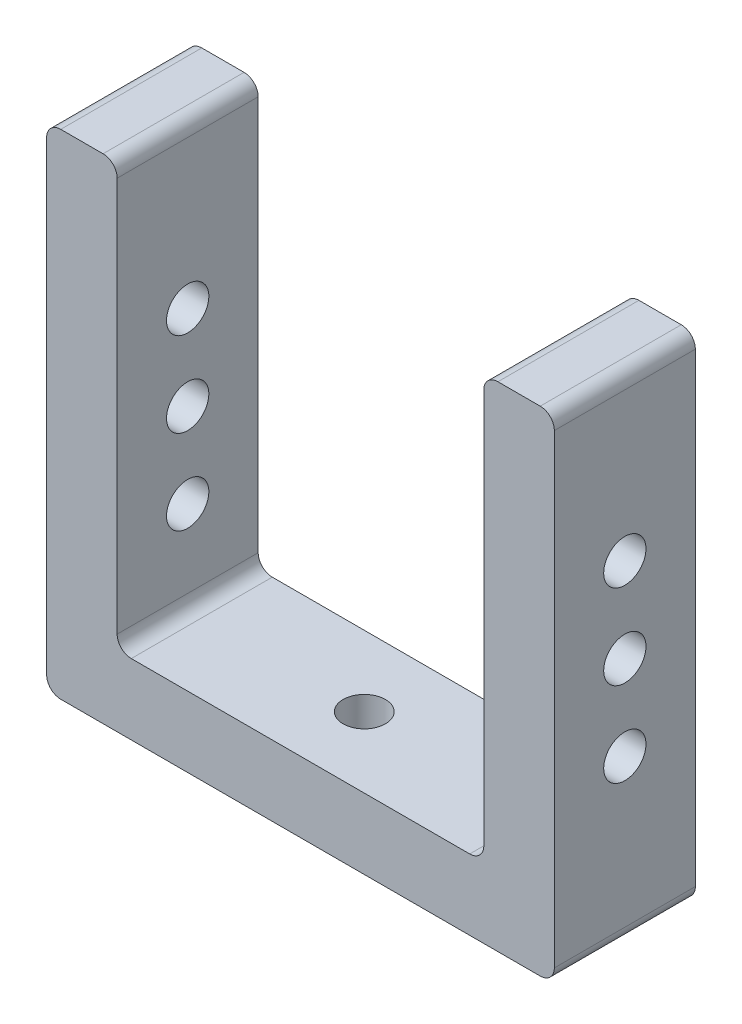
ISO-10303-21;
HEADER;
FILE_DESCRIPTION(('STEP AP214'),'2;1');
FILE_NAME('part.step','',(''),(''),'','','');
FILE_SCHEMA(('AUTOMOTIVE_DESIGN { 1 0 10303 214 1 1 1 1 }'));
ENDSEC;
DATA;
#1=APPLICATION_CONTEXT('core data for automotive mechanical design processes');
#2=APPLICATION_PROTOCOL_DEFINITION('international standard','automotive_design',2000,#1);
#3=PRODUCT_CONTEXT('',#1,'mechanical');
#4=PRODUCT('Part','Part','',(#3));
#5=PRODUCT_RELATED_PRODUCT_CATEGORY('part','',(#4));
#6=PRODUCT_DEFINITION_FORMATION('','',#4);
#7=PRODUCT_DEFINITION_CONTEXT('part definition',#1,'design');
#8=PRODUCT_DEFINITION('design','',#6,#7);
#9=PRODUCT_DEFINITION_SHAPE('','',#8);
#10=(LENGTH_UNIT() NAMED_UNIT(*) SI_UNIT(.MILLI.,.METRE.));
#11=(NAMED_UNIT(*) PLANE_ANGLE_UNIT() SI_UNIT($,.RADIAN.));
#12=(NAMED_UNIT(*) SI_UNIT($,.STERADIAN.) SOLID_ANGLE_UNIT());
#13=UNCERTAINTY_MEASURE_WITH_UNIT(LENGTH_MEASURE(1.E-05),#10,'distance_accuracy_value','');
#14=(GEOMETRIC_REPRESENTATION_CONTEXT(3) GLOBAL_UNCERTAINTY_ASSIGNED_CONTEXT((#13)) GLOBAL_UNIT_ASSIGNED_CONTEXT((#10,
#11,#12)) REPRESENTATION_CONTEXT('',''));
#15=CARTESIAN_POINT('',(0.,0.,0.));
#16=DIRECTION('',(0.,0.,1.));
#17=DIRECTION('',(1.,0.,0.));
#18=AXIS2_PLACEMENT_3D('',#15,#16,#17);
#19=CARTESIAN_POINT('',(-16.0463208437643,-4.00000000000001,10.));
#20=DIRECTION('',(0.,0.,-1.));
#21=DIRECTION('',(-1.,0.,0.));
#22=AXIS2_PLACEMENT_3D('',#19,#20,#21);
#23=CYLINDRICAL_SURFACE('',#22,1.);
#24=CARTESIAN_POINT('',(-16.0463208437643,-4.00000000000001,0.));
#25=DIRECTION('',(0.,0.,-1.));
#26=DIRECTION('',(-1.,0.,0.));
#27=AXIS2_PLACEMENT_3D('',#24,#25,#26);
#28=CIRCLE('',#27,1.);
#29=CARTESIAN_POINT('',(-16.0463208437643,-5.00000000000001,0.));
#30=VERTEX_POINT('',#29);
#31=CARTESIAN_POINT('',(-17.0463208437643,-4.00000000000001,0.));
#32=VERTEX_POINT('',#31);
#33=EDGE_CURVE('E210',#30,#32,#28,.T.);
#34=ORIENTED_EDGE('',*,*,#33,.F.);
#35=DIRECTION('',(0.,0.,-1.));
#36=VECTOR('',#35,1.);
#37=CARTESIAN_POINT('',(-16.0463208437643,-5.00000000000001,10.));
#38=LINE('',#37,#36);
#39=CARTESIAN_POINT('',(-16.0463208437643,-5.00000000000001,10.));
#40=VERTEX_POINT('',#39);
#41=EDGE_CURVE('E176',#40,#30,#38,.T.);
#42=ORIENTED_EDGE('',*,*,#41,.F.);
#43=CARTESIAN_POINT('',(-16.0463208437643,-4.00000000000001,10.));
#44=DIRECTION('',(0.,0.,-1.));
#45=DIRECTION('',(-1.,0.,0.));
#46=AXIS2_PLACEMENT_3D('',#43,#44,#45);
#47=CIRCLE('',#46,1.);
#48=CARTESIAN_POINT('',(-17.0463208437643,-4.00000000000001,10.));
#49=VERTEX_POINT('',#48);
#50=EDGE_CURVE('E172',#40,#49,#47,.T.);
#51=ORIENTED_EDGE('',*,*,#50,.T.);
#52=DIRECTION('',(0.,0.,-1.));
#53=VECTOR('',#52,1.);
#54=CARTESIAN_POINT('',(-17.0463208437643,-4.00000000000001,10.));
#55=LINE('',#54,#53);
#56=EDGE_CURVE('E154',#49,#32,#55,.T.);
#57=ORIENTED_EDGE('',*,*,#56,.T.);
#58=EDGE_LOOP('',(#34,#42,#51,#57));
#59=FACE_BOUND('',#58,.T.);
#60=ADVANCED_FACE('F40',(#59),#23,.T.);
#61=CARTESIAN_POINT('',(17.9536791562357,-5.,10.));
#62=DIRECTION('',(0.,-1.,0.));
#63=DIRECTION('',(1.,0.,0.));
#64=AXIS2_PLACEMENT_3D('',#61,#62,#63);
#65=PLANE('',#64);
#66=CARTESIAN_POINT('',(0.476839578117848,-5.,5.));
#67=DIRECTION('',(0.,-1.,0.));
#68=DIRECTION('',(1.,0.,0.));
#69=AXIS2_PLACEMENT_3D('',#66,#67,#68);
#70=CIRCLE('',#69,1.5);
#71=CARTESIAN_POINT('',(1.97683957811785,-5.,5.));
#72=VERTEX_POINT('',#71);
#73=EDGE_CURVE('E183',#72,#72,#70,.T.);
#74=ORIENTED_EDGE('',*,*,#73,.F.);
#75=EDGE_LOOP('',(#74));
#76=FACE_BOUND('',#75,.T.);
#77=DIRECTION('',(-1.,0.,0.));
#78=VECTOR('',#77,1.);
#79=CARTESIAN_POINT('',(17.9536791562357,-5.,0.));
#80=LINE('',#79,#78);
#81=CARTESIAN_POINT('',(17.9536791562357,-5.,0.));
#82=VERTEX_POINT('',#81);
#83=EDGE_CURVE('E177',#82,#30,#80,.T.);
#84=ORIENTED_EDGE('',*,*,#83,.F.);
#85=DIRECTION('',(0.,0.,-1.));
#86=VECTOR('',#85,1.);
#87=CARTESIAN_POINT('',(17.9536791562357,-5.,10.));
#88=LINE('',#87,#86);
#89=CARTESIAN_POINT('',(17.9536791562357,-5.,10.));
#90=VERTEX_POINT('',#89);
#91=EDGE_CURVE('E239',#90,#82,#88,.T.);
#92=ORIENTED_EDGE('',*,*,#91,.F.);
#93=DIRECTION('',(-1.,0.,0.));
#94=VECTOR('',#93,1.);
#95=CARTESIAN_POINT('',(17.9536791562357,-5.,10.));
#96=LINE('',#95,#94);
#97=EDGE_CURVE('E166',#90,#40,#96,.T.);
#98=ORIENTED_EDGE('',*,*,#97,.T.);
#99=ORIENTED_EDGE('',*,*,#41,.T.);
#100=EDGE_LOOP('',(#84,#92,#98,#99));
#101=FACE_BOUND('',#100,.T.);
#102=ADVANCED_FACE('F292',(#76,#101),#65,.T.);
#103=CARTESIAN_POINT('',(17.9536791562357,-4.,10.));
#104=DIRECTION('',(0.,0.,-1.));
#105=DIRECTION('',(-1.,0.,0.));
#106=AXIS2_PLACEMENT_3D('',#103,#104,#105);
#107=CYLINDRICAL_SURFACE('',#106,1.);
#108=CARTESIAN_POINT('',(17.9536791562357,-4.,0.));
#109=DIRECTION('',(0.,0.,-1.));
#110=DIRECTION('',(-1.,0.,0.));
#111=AXIS2_PLACEMENT_3D('',#108,#109,#110);
#112=CIRCLE('',#111,1.);
#113=CARTESIAN_POINT('',(18.9536791562357,-4.,0.));
#114=VERTEX_POINT('',#113);
#115=EDGE_CURVE('E180',#114,#82,#112,.T.);
#116=ORIENTED_EDGE('',*,*,#115,.F.);
#117=DIRECTION('',(0.,0.,-1.));
#118=VECTOR('',#117,1.);
#119=CARTESIAN_POINT('',(18.9536791562357,-4.,10.));
#120=LINE('',#119,#118);
#121=CARTESIAN_POINT('',(18.9536791562357,-4.,10.));
#122=VERTEX_POINT('',#121);
#123=EDGE_CURVE('E241',#122,#114,#120,.T.);
#124=ORIENTED_EDGE('',*,*,#123,.F.);
#125=CARTESIAN_POINT('',(17.9536791562357,-4.,10.));
#126=DIRECTION('',(0.,0.,-1.));
#127=DIRECTION('',(-1.,0.,0.));
#128=AXIS2_PLACEMENT_3D('',#125,#126,#127);
#129=CIRCLE('',#128,1.);
#130=EDGE_CURVE('E206',#122,#90,#129,.T.);
#131=ORIENTED_EDGE('',*,*,#130,.T.);
#132=ORIENTED_EDGE('',*,*,#91,.T.);
#133=EDGE_LOOP('',(#116,#124,#131,#132));
#134=FACE_BOUND('',#133,.T.);
#135=ADVANCED_FACE('F297',(#134),#107,.T.);
#136=CARTESIAN_POINT('',(18.9536791562357,30.,10.));
#137=DIRECTION('',(1.,0.,0.));
#138=DIRECTION('',(0.,1.,0.));
#139=AXIS2_PLACEMENT_3D('',#136,#137,#138);
#140=PLANE('',#139);
#141=CARTESIAN_POINT('',(18.9536791562357,18.5,5.));
#142=DIRECTION('',(-1.,0.,0.));
#143=DIRECTION('',(0.,0.,1.));
#144=AXIS2_PLACEMENT_3D('',#141,#142,#143);
#145=CIRCLE('',#144,1.5);
#146=CARTESIAN_POINT('',(18.9536791562357,18.5,6.5));
#147=VERTEX_POINT('',#146);
#148=EDGE_CURVE('E432',#147,#147,#145,.T.);
#149=ORIENTED_EDGE('',*,*,#148,.T.);
#150=EDGE_LOOP('',(#149));
#151=FACE_BOUND('',#150,.T.);
#152=CARTESIAN_POINT('',(18.9536791562357,6.5,5.));
#153=DIRECTION('',(-1.,0.,0.));
#154=DIRECTION('',(0.,0.,1.));
#155=AXIS2_PLACEMENT_3D('',#152,#153,#154);
#156=CIRCLE('',#155,1.5);
#157=CARTESIAN_POINT('',(18.9536791562357,6.5,6.5));
#158=VERTEX_POINT('',#157);
#159=EDGE_CURVE('E438',#158,#158,#156,.T.);
#160=ORIENTED_EDGE('',*,*,#159,.T.);
#161=EDGE_LOOP('',(#160));
#162=FACE_BOUND('',#161,.T.);
#163=CARTESIAN_POINT('',(18.9536791562357,12.5,5.));
#164=DIRECTION('',(-1.,0.,0.));
#165=DIRECTION('',(0.,0.,1.));
#166=AXIS2_PLACEMENT_3D('',#163,#164,#165);
#167=CIRCLE('',#166,1.5);
#168=CARTESIAN_POINT('',(18.9536791562357,12.5,6.5));
#169=VERTEX_POINT('',#168);
#170=EDGE_CURVE('E425',#169,#169,#167,.T.);
#171=ORIENTED_EDGE('',*,*,#170,.T.);
#172=EDGE_LOOP('',(#171));
#173=FACE_BOUND('',#172,.T.);
#174=DIRECTION('',(0.,-1.,0.));
#175=VECTOR('',#174,1.);
#176=CARTESIAN_POINT('',(18.9536791562357,30.,0.));
#177=LINE('',#176,#175);
#178=CARTESIAN_POINT('',(18.9536791562357,29.,0.));
#179=VERTEX_POINT('',#178);
#180=EDGE_CURVE('E233',#179,#114,#177,.T.);
#181=ORIENTED_EDGE('',*,*,#180,.F.);
#182=DIRECTION('',(0.,0.,-1.));
#183=VECTOR('',#182,1.);
#184=CARTESIAN_POINT('',(18.9536791562357,29.,10.));
#185=LINE('',#184,#183);
#186=CARTESIAN_POINT('',(18.9536791562357,29.,10.));
#187=VERTEX_POINT('',#186);
#188=EDGE_CURVE('E264',#179,#187,#185,.F.);
#189=ORIENTED_EDGE('',*,*,#188,.T.);
#190=DIRECTION('',(0.,-1.,0.));
#191=VECTOR('',#190,1.);
#192=CARTESIAN_POINT('',(18.9536791562357,30.,10.));
#193=LINE('',#192,#191);
#194=EDGE_CURVE('E204',#187,#122,#193,.T.);
#195=ORIENTED_EDGE('',*,*,#194,.T.);
#196=ORIENTED_EDGE('',*,*,#123,.T.);
#197=EDGE_LOOP('',(#181,#189,#195,#196));
#198=FACE_BOUND('',#197,.T.);
#199=ADVANCED_FACE('F300',(#151,#162,#173,#198),#140,.T.);
#200=CARTESIAN_POINT('',(13.9536791562357,30.,10.));
#201=DIRECTION('',(0.,1.,0.));
#202=DIRECTION('',(0.,0.,1.));
#203=AXIS2_PLACEMENT_3D('',#200,#201,#202);
#204=PLANE('',#203);
#205=DIRECTION('',(1.,0.,0.));
#206=VECTOR('',#205,1.);
#207=CARTESIAN_POINT('',(13.9536791562357,30.,10.));
#208=LINE('',#207,#206);
#209=CARTESIAN_POINT('',(14.9536791562357,30.,10.));
#210=VERTEX_POINT('',#209);
#211=CARTESIAN_POINT('',(17.9536791562357,30.,10.));
#212=VERTEX_POINT('',#211);
#213=EDGE_CURVE('E201',#210,#212,#208,.T.);
#214=ORIENTED_EDGE('',*,*,#213,.T.);
#215=DIRECTION('',(0.,0.,-1.));
#216=VECTOR('',#215,1.);
#217=CARTESIAN_POINT('',(17.9536791562357,30.,10.));
#218=LINE('',#217,#216);
#219=CARTESIAN_POINT('',(17.9536791562357,30.,0.));
#220=VERTEX_POINT('',#219);
#221=EDGE_CURVE('E253',#212,#220,#218,.T.);
#222=ORIENTED_EDGE('',*,*,#221,.T.);
#223=DIRECTION('',(1.,0.,0.));
#224=VECTOR('',#223,1.);
#225=CARTESIAN_POINT('',(13.9536791562357,30.,0.));
#226=LINE('',#225,#224);
#227=CARTESIAN_POINT('',(14.9536791562357,30.,0.));
#228=VERTEX_POINT('',#227);
#229=EDGE_CURVE('E230',#228,#220,#226,.T.);
#230=ORIENTED_EDGE('',*,*,#229,.F.);
#231=DIRECTION('',(0.,0.,-1.));
#232=VECTOR('',#231,1.);
#233=CARTESIAN_POINT('',(14.9536791562357,30.,10.));
#234=LINE('',#233,#232);
#235=EDGE_CURVE('E238',#228,#210,#234,.F.);
#236=ORIENTED_EDGE('',*,*,#235,.T.);
#237=EDGE_LOOP('',(#214,#222,#230,#236));
#238=FACE_BOUND('',#237,.T.);
#239=ADVANCED_FACE('F308',(#238),#204,.T.);
#240=CARTESIAN_POINT('',(13.9536791562357,1.,10.));
#241=DIRECTION('',(-1.,0.,0.));
#242=DIRECTION('',(0.,0.,1.));
#243=AXIS2_PLACEMENT_3D('',#240,#241,#242);
#244=PLANE('',#243);
#245=CARTESIAN_POINT('',(13.9536791562357,18.5,5.));
#246=DIRECTION('',(-1.,0.,0.));
#247=DIRECTION('',(0.,0.,1.));
#248=AXIS2_PLACEMENT_3D('',#245,#246,#247);
#249=CIRCLE('',#248,1.5);
#250=CARTESIAN_POINT('',(13.9536791562357,18.5,6.5));
#251=VERTEX_POINT('',#250);
#252=EDGE_CURVE('E404',#251,#251,#249,.T.);
#253=ORIENTED_EDGE('',*,*,#252,.F.);
#254=EDGE_LOOP('',(#253));
#255=FACE_BOUND('',#254,.T.);
#256=CARTESIAN_POINT('',(13.9536791562357,6.5,5.));
#257=DIRECTION('',(-1.,0.,0.));
#258=DIRECTION('',(0.,0.,1.));
#259=AXIS2_PLACEMENT_3D('',#256,#257,#258);
#260=CIRCLE('',#259,1.5);
#261=CARTESIAN_POINT('',(13.9536791562357,6.5,6.5));
#262=VERTEX_POINT('',#261);
#263=EDGE_CURVE('E411',#262,#262,#260,.T.);
#264=ORIENTED_EDGE('',*,*,#263,.F.);
#265=EDGE_LOOP('',(#264));
#266=FACE_BOUND('',#265,.T.);
#267=CARTESIAN_POINT('',(13.9536791562357,12.5,5.));
#268=DIRECTION('',(-1.,0.,0.));
#269=DIRECTION('',(0.,0.,1.));
#270=AXIS2_PLACEMENT_3D('',#267,#268,#269);
#271=CIRCLE('',#270,1.5);
#272=CARTESIAN_POINT('',(13.9536791562357,12.5,6.5));
#273=VERTEX_POINT('',#272);
#274=EDGE_CURVE('E419',#273,#273,#271,.T.);
#275=ORIENTED_EDGE('',*,*,#274,.F.);
#276=EDGE_LOOP('',(#275));
#277=FACE_BOUND('',#276,.T.);
#278=DIRECTION('',(0.,1.,0.));
#279=VECTOR('',#278,1.);
#280=CARTESIAN_POINT('',(13.9536791562357,1.,10.));
#281=LINE('',#280,#279);
#282=CARTESIAN_POINT('',(13.9536791562357,1.,10.));
#283=VERTEX_POINT('',#282);
#284=CARTESIAN_POINT('',(13.9536791562357,29.,10.));
#285=VERTEX_POINT('',#284);
#286=EDGE_CURVE('E198',#283,#285,#281,.T.);
#287=ORIENTED_EDGE('',*,*,#286,.T.);
#288=DIRECTION('',(0.,0.,-1.));
#289=VECTOR('',#288,1.);
#290=CARTESIAN_POINT('',(13.9536791562357,29.,10.));
#291=LINE('',#290,#289);
#292=CARTESIAN_POINT('',(13.9536791562357,29.,0.));
#293=VERTEX_POINT('',#292);
#294=EDGE_CURVE('E272',#285,#293,#291,.T.);
#295=ORIENTED_EDGE('',*,*,#294,.T.);
#296=DIRECTION('',(0.,1.,0.));
#297=VECTOR('',#296,1.);
#298=CARTESIAN_POINT('',(13.9536791562357,1.,0.));
#299=LINE('',#298,#297);
#300=CARTESIAN_POINT('',(13.9536791562357,1.,0.));
#301=VERTEX_POINT('',#300);
#302=EDGE_CURVE('E227',#301,#293,#299,.T.);
#303=ORIENTED_EDGE('',*,*,#302,.F.);
#304=DIRECTION('',(0.,0.,-1.));
#305=VECTOR('',#304,1.);
#306=CARTESIAN_POINT('',(13.9536791562357,1.,10.));
#307=LINE('',#306,#305);
#308=EDGE_CURVE('E244',#283,#301,#307,.T.);
#309=ORIENTED_EDGE('',*,*,#308,.F.);
#310=EDGE_LOOP('',(#287,#295,#303,#309));
#311=FACE_BOUND('',#310,.T.);
#312=ADVANCED_FACE('F317',(#255,#266,#277,#311),#244,.T.);
#313=CARTESIAN_POINT('',(12.9536791562357,1.,10.));
#314=DIRECTION('',(0.,0.,-1.));
#315=DIRECTION('',(-1.,0.,0.));
#316=AXIS2_PLACEMENT_3D('',#313,#314,#315);
#317=CYLINDRICAL_SURFACE('',#316,1.);
#318=CARTESIAN_POINT('',(12.9536791562357,1.,0.));
#319=DIRECTION('',(0.,0.,1.));
#320=DIRECTION('',(1.,0.,0.));
#321=AXIS2_PLACEMENT_3D('',#318,#319,#320);
#322=CIRCLE('',#321,1.);
#323=CARTESIAN_POINT('',(12.9536791562357,0.,0.));
#324=VERTEX_POINT('',#323);
#325=EDGE_CURVE('E224',#324,#301,#322,.T.);
#326=ORIENTED_EDGE('',*,*,#325,.F.);
#327=DIRECTION('',(0.,0.,-1.));
#328=VECTOR('',#327,1.);
#329=CARTESIAN_POINT('',(12.9536791562357,0.,10.));
#330=LINE('',#329,#328);
#331=CARTESIAN_POINT('',(12.9536791562357,0.,10.));
#332=VERTEX_POINT('',#331);
#333=EDGE_CURVE('E246',#332,#324,#330,.T.);
#334=ORIENTED_EDGE('',*,*,#333,.F.);
#335=CARTESIAN_POINT('',(12.9536791562357,1.,10.));
#336=DIRECTION('',(0.,0.,1.));
#337=DIRECTION('',(1.,0.,0.));
#338=AXIS2_PLACEMENT_3D('',#335,#336,#337);
#339=CIRCLE('',#338,1.);
#340=EDGE_CURVE('E195',#332,#283,#339,.T.);
#341=ORIENTED_EDGE('',*,*,#340,.T.);
#342=ORIENTED_EDGE('',*,*,#308,.T.);
#343=EDGE_LOOP('',(#326,#334,#341,#342));
#344=FACE_BOUND('',#343,.T.);
#345=ADVANCED_FACE('F321',(#344),#317,.F.);
#346=CARTESIAN_POINT('',(-11.0463208437643,0.,10.));
#347=DIRECTION('',(0.,1.,0.));
#348=DIRECTION('',(0.,0.,1.));
#349=AXIS2_PLACEMENT_3D('',#346,#347,#348);
#350=PLANE('',#349);
#351=CARTESIAN_POINT('',(0.476839578117847,0.,5.));
#352=DIRECTION('',(0.,1.,0.));
#353=DIRECTION('',(0.,0.,1.));
#354=AXIS2_PLACEMENT_3D('',#351,#352,#353);
#355=CIRCLE('',#354,1.5);
#356=CARTESIAN_POINT('',(0.476839578117847,0.,6.5));
#357=VERTEX_POINT('',#356);
#358=EDGE_CURVE('E44',#357,#357,#355,.T.);
#359=ORIENTED_EDGE('',*,*,#358,.F.);
#360=EDGE_LOOP('',(#359));
#361=FACE_BOUND('',#360,.T.);
#362=DIRECTION('',(1.,0.,0.));
#363=VECTOR('',#362,1.);
#364=CARTESIAN_POINT('',(-11.0463208437643,0.,0.));
#365=LINE('',#364,#363);
#366=CARTESIAN_POINT('',(-11.0463208437643,0.,0.));
#367=VERTEX_POINT('',#366);
#368=EDGE_CURVE('E221',#367,#324,#365,.T.);
#369=ORIENTED_EDGE('',*,*,#368,.F.);
#370=DIRECTION('',(0.,0.,-1.));
#371=VECTOR('',#370,1.);
#372=CARTESIAN_POINT('',(-11.0463208437643,0.,10.));
#373=LINE('',#372,#371);
#374=CARTESIAN_POINT('',(-11.0463208437643,0.,10.));
#375=VERTEX_POINT('',#374);
#376=EDGE_CURVE('E248',#375,#367,#373,.T.);
#377=ORIENTED_EDGE('',*,*,#376,.F.);
#378=DIRECTION('',(1.,0.,0.));
#379=VECTOR('',#378,1.);
#380=CARTESIAN_POINT('',(-11.0463208437643,0.,10.));
#381=LINE('',#380,#379);
#382=EDGE_CURVE('E192',#375,#332,#381,.T.);
#383=ORIENTED_EDGE('',*,*,#382,.T.);
#384=ORIENTED_EDGE('',*,*,#333,.T.);
#385=EDGE_LOOP('',(#369,#377,#383,#384));
#386=FACE_BOUND('',#385,.T.);
#387=ADVANCED_FACE('F326',(#361,#386),#350,.T.);
#388=CARTESIAN_POINT('',(-11.0463208437643,1.,10.));
#389=DIRECTION('',(0.,0.,-1.));
#390=DIRECTION('',(-1.,0.,0.));
#391=AXIS2_PLACEMENT_3D('',#388,#389,#390);
#392=CYLINDRICAL_SURFACE('',#391,1.);
#393=CARTESIAN_POINT('',(-11.0463208437643,1.,0.));
#394=DIRECTION('',(0.,0.,1.));
#395=DIRECTION('',(1.,0.,0.));
#396=AXIS2_PLACEMENT_3D('',#393,#394,#395);
#397=CIRCLE('',#396,1.);
#398=CARTESIAN_POINT('',(-12.0463208437643,1.00000000000001,0.));
#399=VERTEX_POINT('',#398);
#400=EDGE_CURVE('E218',#399,#367,#397,.T.);
#401=ORIENTED_EDGE('',*,*,#400,.F.);
#402=DIRECTION('',(0.,0.,-1.));
#403=VECTOR('',#402,1.);
#404=CARTESIAN_POINT('',(-12.0463208437643,1.00000000000001,10.));
#405=LINE('',#404,#403);
#406=CARTESIAN_POINT('',(-12.0463208437643,1.00000000000001,10.));
#407=VERTEX_POINT('',#406);
#408=EDGE_CURVE('E165',#407,#399,#405,.T.);
#409=ORIENTED_EDGE('',*,*,#408,.F.);
#410=CARTESIAN_POINT('',(-11.0463208437643,1.,10.));
#411=DIRECTION('',(0.,0.,1.));
#412=DIRECTION('',(1.,0.,0.));
#413=AXIS2_PLACEMENT_3D('',#410,#411,#412);
#414=CIRCLE('',#413,1.);
#415=EDGE_CURVE('E189',#407,#375,#414,.T.);
#416=ORIENTED_EDGE('',*,*,#415,.T.);
#417=ORIENTED_EDGE('',*,*,#376,.T.);
#418=EDGE_LOOP('',(#401,#409,#416,#417));
#419=FACE_BOUND('',#418,.T.);
#420=ADVANCED_FACE('F329',(#419),#392,.F.);
#421=CARTESIAN_POINT('',(-12.0463208437643,30.,10.));
#422=DIRECTION('',(1.,0.,0.));
#423=DIRECTION('',(0.,1.,0.));
#424=AXIS2_PLACEMENT_3D('',#421,#422,#423);
#425=PLANE('',#424);
#426=CARTESIAN_POINT('',(-12.0463208437643,18.5,5.));
#427=DIRECTION('',(1.,0.,0.));
#428=DIRECTION('',(0.,1.,0.));
#429=AXIS2_PLACEMENT_3D('',#426,#427,#428);
#430=CIRCLE('',#429,1.5);
#431=CARTESIAN_POINT('',(-12.0463208437643,20.,5.));
#432=VERTEX_POINT('',#431);
#433=EDGE_CURVE('E407',#432,#432,#430,.T.);
#434=ORIENTED_EDGE('',*,*,#433,.F.);
#435=EDGE_LOOP('',(#434));
#436=FACE_BOUND('',#435,.T.);
#437=CARTESIAN_POINT('',(-12.0463208437643,6.5,5.));
#438=DIRECTION('',(1.,0.,0.));
#439=DIRECTION('',(0.,1.,0.));
#440=AXIS2_PLACEMENT_3D('',#437,#438,#439);
#441=CIRCLE('',#440,1.5);
#442=CARTESIAN_POINT('',(-12.0463208437643,8.,5.));
#443=VERTEX_POINT('',#442);
#444=EDGE_CURVE('E416',#443,#443,#441,.T.);
#445=ORIENTED_EDGE('',*,*,#444,.F.);
#446=EDGE_LOOP('',(#445));
#447=FACE_BOUND('',#446,.T.);
#448=CARTESIAN_POINT('',(-12.0463208437643,12.5,5.));
#449=DIRECTION('',(1.,0.,0.));
#450=DIRECTION('',(0.,1.,0.));
#451=AXIS2_PLACEMENT_3D('',#448,#449,#450);
#452=CIRCLE('',#451,1.5);
#453=CARTESIAN_POINT('',(-12.0463208437643,14.,5.));
#454=VERTEX_POINT('',#453);
#455=EDGE_CURVE('E422',#454,#454,#452,.T.);
#456=ORIENTED_EDGE('',*,*,#455,.F.);
#457=EDGE_LOOP('',(#456));
#458=FACE_BOUND('',#457,.T.);
#459=DIRECTION('',(0.,-1.,0.));
#460=VECTOR('',#459,1.);
#461=CARTESIAN_POINT('',(-12.0463208437643,30.,0.));
#462=LINE('',#461,#460);
#463=CARTESIAN_POINT('',(-12.0463208437643,29.,0.));
#464=VERTEX_POINT('',#463);
#465=EDGE_CURVE('E216',#464,#399,#462,.T.);
#466=ORIENTED_EDGE('',*,*,#465,.F.);
#467=DIRECTION('',(0.,0.,-1.));
#468=VECTOR('',#467,1.);
#469=CARTESIAN_POINT('',(-12.0463208437643,29.,10.));
#470=LINE('',#469,#468);
#471=CARTESIAN_POINT('',(-12.0463208437643,29.,10.));
#472=VERTEX_POINT('',#471);
#473=EDGE_CURVE('E11',#464,#472,#470,.F.);
#474=ORIENTED_EDGE('',*,*,#473,.T.);
#475=DIRECTION('',(0.,-1.,0.));
#476=VECTOR('',#475,1.);
#477=CARTESIAN_POINT('',(-12.0463208437643,30.,10.));
#478=LINE('',#477,#476);
#479=EDGE_CURVE('E187',#472,#407,#478,.T.);
#480=ORIENTED_EDGE('',*,*,#479,.T.);
#481=ORIENTED_EDGE('',*,*,#408,.T.);
#482=EDGE_LOOP('',(#466,#474,#480,#481));
#483=FACE_BOUND('',#482,.T.);
#484=ADVANCED_FACE('F335',(#436,#447,#458,#483),#425,.T.);
#485=CARTESIAN_POINT('',(-17.0463208437643,30.,10.));
#486=DIRECTION('',(0.,1.,0.));
#487=DIRECTION('',(0.,0.,1.));
#488=AXIS2_PLACEMENT_3D('',#485,#486,#487);
#489=PLANE('',#488);
#490=DIRECTION('',(1.,0.,0.));
#491=VECTOR('',#490,1.);
#492=CARTESIAN_POINT('',(-17.0463208437643,30.,0.));
#493=LINE('',#492,#491);
#494=CARTESIAN_POINT('',(-16.0463208437643,30.,0.));
#495=VERTEX_POINT('',#494);
#496=CARTESIAN_POINT('',(-13.0463208437643,30.,0.));
#497=VERTEX_POINT('',#496);
#498=EDGE_CURVE('E213',#495,#497,#493,.T.);
#499=ORIENTED_EDGE('',*,*,#498,.F.);
#500=DIRECTION('',(0.,0.,-1.));
#501=VECTOR('',#500,1.);
#502=CARTESIAN_POINT('',(-16.0463208437643,30.,10.));
#503=LINE('',#502,#501);
#504=CARTESIAN_POINT('',(-16.0463208437643,30.,10.));
#505=VERTEX_POINT('',#504);
#506=EDGE_CURVE('E49',#495,#505,#503,.F.);
#507=ORIENTED_EDGE('',*,*,#506,.T.);
#508=DIRECTION('',(1.,0.,0.));
#509=VECTOR('',#508,1.);
#510=CARTESIAN_POINT('',(-17.0463208437643,30.,10.));
#511=LINE('',#510,#509);
#512=CARTESIAN_POINT('',(-13.0463208437643,30.,10.));
#513=VERTEX_POINT('',#512);
#514=EDGE_CURVE('E174',#505,#513,#511,.T.);
#515=ORIENTED_EDGE('',*,*,#514,.T.);
#516=DIRECTION('',(0.,0.,-1.));
#517=VECTOR('',#516,1.);
#518=CARTESIAN_POINT('',(-13.0463208437643,30.,10.));
#519=LINE('',#518,#517);
#520=EDGE_CURVE('E277',#513,#497,#519,.T.);
#521=ORIENTED_EDGE('',*,*,#520,.T.);
#522=EDGE_LOOP('',(#499,#507,#515,#521));
#523=FACE_BOUND('',#522,.T.);
#524=ADVANCED_FACE('F283',(#523),#489,.T.);
#525=CARTESIAN_POINT('',(-17.0463208437643,-4.00000000000001,10.));
#526=DIRECTION('',(-1.,0.,0.));
#527=DIRECTION('',(0.,0.,1.));
#528=AXIS2_PLACEMENT_3D('',#525,#526,#527);
#529=PLANE('',#528);
#530=CARTESIAN_POINT('',(-17.0463208437643,18.5,5.));
#531=DIRECTION('',(-1.,0.,0.));
#532=DIRECTION('',(0.,0.,1.));
#533=AXIS2_PLACEMENT_3D('',#530,#531,#532);
#534=CIRCLE('',#533,1.5);
#535=CARTESIAN_POINT('',(-17.0463208437643,18.5,6.5));
#536=VERTEX_POINT('',#535);
#537=EDGE_CURVE('E435',#536,#536,#534,.T.);
#538=ORIENTED_EDGE('',*,*,#537,.F.);
#539=EDGE_LOOP('',(#538));
#540=FACE_BOUND('',#539,.T.);
#541=CARTESIAN_POINT('',(-17.0463208437643,6.5,5.));
#542=DIRECTION('',(-1.,0.,0.));
#543=DIRECTION('',(0.,0.,1.));
#544=AXIS2_PLACEMENT_3D('',#541,#542,#543);
#545=CIRCLE('',#544,1.5);
#546=CARTESIAN_POINT('',(-17.0463208437643,6.5,6.5));
#547=VERTEX_POINT('',#546);
#548=EDGE_CURVE('E429',#547,#547,#545,.T.);
#549=ORIENTED_EDGE('',*,*,#548,.F.);
#550=EDGE_LOOP('',(#549));
#551=FACE_BOUND('',#550,.T.);
#552=CARTESIAN_POINT('',(-17.0463208437643,12.5,5.));
#553=DIRECTION('',(-1.,0.,0.));
#554=DIRECTION('',(0.,0.,1.));
#555=AXIS2_PLACEMENT_3D('',#552,#553,#554);
#556=CIRCLE('',#555,1.5);
#557=CARTESIAN_POINT('',(-17.0463208437643,12.5,6.5));
#558=VERTEX_POINT('',#557);
#559=EDGE_CURVE('E426',#558,#558,#556,.T.);
#560=ORIENTED_EDGE('',*,*,#559,.F.);
#561=EDGE_LOOP('',(#560));
#562=FACE_BOUND('',#561,.T.);
#563=DIRECTION('',(0.,1.,0.));
#564=VECTOR('',#563,1.);
#565=CARTESIAN_POINT('',(-17.0463208437643,-4.00000000000001,10.));
#566=LINE('',#565,#564);
#567=CARTESIAN_POINT('',(-17.0463208437643,29.,10.));
#568=VERTEX_POINT('',#567);
#569=EDGE_CURVE('E157',#49,#568,#566,.T.);
#570=ORIENTED_EDGE('',*,*,#569,.T.);
#571=DIRECTION('',(0.,0.,-1.));
#572=VECTOR('',#571,1.);
#573=CARTESIAN_POINT('',(-17.0463208437643,29.,10.));
#574=LINE('',#573,#572);
#575=CARTESIAN_POINT('',(-17.0463208437643,29.,0.));
#576=VERTEX_POINT('',#575);
#577=EDGE_CURVE('E275',#568,#576,#574,.T.);
#578=ORIENTED_EDGE('',*,*,#577,.T.);
#579=DIRECTION('',(0.,1.,0.));
#580=VECTOR('',#579,1.);
#581=CARTESIAN_POINT('',(-17.0463208437643,-4.00000000000001,0.));
#582=LINE('',#581,#580);
#583=EDGE_CURVE('E160',#32,#576,#582,.T.);
#584=ORIENTED_EDGE('',*,*,#583,.F.);
#585=ORIENTED_EDGE('',*,*,#56,.F.);
#586=EDGE_LOOP('',(#570,#578,#584,#585));
#587=FACE_BOUND('',#586,.T.);
#588=ADVANCED_FACE('F155',(#540,#551,#562,#587),#529,.T.);
#589=CARTESIAN_POINT('',(-16.0463208437643,-4.00000000000001,10.));
#590=DIRECTION('',(0.,0.,-1.));
#591=DIRECTION('',(-1.,0.,0.));
#592=AXIS2_PLACEMENT_3D('',#589,#590,#591);
#593=PLANE('',#592);
#594=ORIENTED_EDGE('',*,*,#194,.F.);
#595=CARTESIAN_POINT('',(17.9536791562357,29.,10.));
#596=DIRECTION('',(0.,0.,-1.));
#597=DIRECTION('',(-1.,0.,0.));
#598=AXIS2_PLACEMENT_3D('',#595,#596,#597);
#599=CIRCLE('',#598,1.);
#600=EDGE_CURVE('E270',#187,#212,#599,.F.);
#601=ORIENTED_EDGE('',*,*,#600,.T.);
#602=ORIENTED_EDGE('',*,*,#213,.F.);
#603=CARTESIAN_POINT('',(14.9536791562357,29.,10.));
#604=DIRECTION('',(0.,0.,-1.));
#605=DIRECTION('',(-1.,0.,0.));
#606=AXIS2_PLACEMENT_3D('',#603,#604,#605);
#607=CIRCLE('',#606,1.);
#608=EDGE_CURVE('E268',#210,#285,#607,.F.);
#609=ORIENTED_EDGE('',*,*,#608,.T.);
#610=ORIENTED_EDGE('',*,*,#286,.F.);
#611=ORIENTED_EDGE('',*,*,#340,.F.);
#612=ORIENTED_EDGE('',*,*,#382,.F.);
#613=ORIENTED_EDGE('',*,*,#415,.F.);
#614=ORIENTED_EDGE('',*,*,#479,.F.);
#615=CARTESIAN_POINT('',(-13.0463208437643,29.,10.));
#616=DIRECTION('',(0.,0.,-1.));
#617=DIRECTION('',(-1.,0.,0.));
#618=AXIS2_PLACEMENT_3D('',#615,#616,#617);
#619=CIRCLE('',#618,1.);
#620=EDGE_CURVE('E62',#472,#513,#619,.F.);
#621=ORIENTED_EDGE('',*,*,#620,.T.);
#622=ORIENTED_EDGE('',*,*,#514,.F.);
#623=CARTESIAN_POINT('',(-16.0463208437643,29.,10.));
#624=DIRECTION('',(0.,0.,-1.));
#625=DIRECTION('',(-1.,0.,0.));
#626=AXIS2_PLACEMENT_3D('',#623,#624,#625);
#627=CIRCLE('',#626,1.);
#628=EDGE_CURVE('E56',#505,#568,#627,.F.);
#629=ORIENTED_EDGE('',*,*,#628,.T.);
#630=ORIENTED_EDGE('',*,*,#569,.F.);
#631=ORIENTED_EDGE('',*,*,#50,.F.);
#632=ORIENTED_EDGE('',*,*,#97,.F.);
#633=ORIENTED_EDGE('',*,*,#130,.F.);
#634=EDGE_LOOP('',(#594,#601,#602,#609,#610,#611,#612,#613,#614,#621,#622,#629,#630,#631,#632,#633));
#635=FACE_BOUND('',#634,.T.);
#636=ADVANCED_FACE('F170',(#635),#593,.F.);
#637=CARTESIAN_POINT('',(-16.0463208437643,-4.00000000000001,0.));
#638=DIRECTION('',(0.,0.,-1.));
#639=DIRECTION('',(-1.,0.,0.));
#640=AXIS2_PLACEMENT_3D('',#637,#638,#639);
#641=PLANE('',#640);
#642=ORIENTED_EDGE('',*,*,#229,.T.);
#643=CARTESIAN_POINT('',(17.9536791562357,29.,0.));
#644=DIRECTION('',(0.,0.,-1.));
#645=DIRECTION('',(-1.,0.,0.));
#646=AXIS2_PLACEMENT_3D('',#643,#644,#645);
#647=CIRCLE('',#646,1.);
#648=EDGE_CURVE('E262',#220,#179,#647,.T.);
#649=ORIENTED_EDGE('',*,*,#648,.T.);
#650=ORIENTED_EDGE('',*,*,#180,.T.);
#651=ORIENTED_EDGE('',*,*,#115,.T.);
#652=ORIENTED_EDGE('',*,*,#83,.T.);
#653=ORIENTED_EDGE('',*,*,#33,.T.);
#654=ORIENTED_EDGE('',*,*,#583,.T.);
#655=CARTESIAN_POINT('',(-16.0463208437643,29.,0.));
#656=DIRECTION('',(0.,0.,-1.));
#657=DIRECTION('',(-1.,0.,0.));
#658=AXIS2_PLACEMENT_3D('',#655,#656,#657);
#659=CIRCLE('',#658,1.);
#660=EDGE_CURVE('E258',#576,#495,#659,.T.);
#661=ORIENTED_EDGE('',*,*,#660,.T.);
#662=ORIENTED_EDGE('',*,*,#498,.T.);
#663=CARTESIAN_POINT('',(-13.0463208437643,29.,0.));
#664=DIRECTION('',(0.,0.,-1.));
#665=DIRECTION('',(-1.,0.,0.));
#666=AXIS2_PLACEMENT_3D('',#663,#664,#665);
#667=CIRCLE('',#666,1.);
#668=EDGE_CURVE('E256',#497,#464,#667,.T.);
#669=ORIENTED_EDGE('',*,*,#668,.T.);
#670=ORIENTED_EDGE('',*,*,#465,.T.);
#671=ORIENTED_EDGE('',*,*,#400,.T.);
#672=ORIENTED_EDGE('',*,*,#368,.T.);
#673=ORIENTED_EDGE('',*,*,#325,.T.);
#674=ORIENTED_EDGE('',*,*,#302,.T.);
#675=CARTESIAN_POINT('',(14.9536791562357,29.,0.));
#676=DIRECTION('',(0.,0.,-1.));
#677=DIRECTION('',(-1.,0.,0.));
#678=AXIS2_PLACEMENT_3D('',#675,#676,#677);
#679=CIRCLE('',#678,1.);
#680=EDGE_CURVE('E260',#293,#228,#679,.T.);
#681=ORIENTED_EDGE('',*,*,#680,.T.);
#682=EDGE_LOOP('',(#642,#649,#650,#651,#652,#653,#654,#661,#662,#669,#670,#671,#672,#673,#674,#681));
#683=FACE_BOUND('',#682,.T.);
#684=ADVANCED_FACE('F288',(#683),#641,.T.);
#685=CARTESIAN_POINT('',(17.9536791562357,29.,10.));
#686=DIRECTION('',(0.,0.,-1.));
#687=DIRECTION('',(-1.,0.,0.));
#688=AXIS2_PLACEMENT_3D('',#685,#686,#687);
#689=CYLINDRICAL_SURFACE('',#688,1.);
#690=ORIENTED_EDGE('',*,*,#600,.F.);
#691=ORIENTED_EDGE('',*,*,#188,.F.);
#692=ORIENTED_EDGE('',*,*,#648,.F.);
#693=ORIENTED_EDGE('',*,*,#221,.F.);
#694=EDGE_LOOP('',(#690,#691,#692,#693));
#695=FACE_BOUND('',#694,.T.);
#696=ADVANCED_FACE('F303',(#695),#689,.T.);
#697=CARTESIAN_POINT('',(14.9536791562357,29.,10.));
#698=DIRECTION('',(0.,0.,-1.));
#699=DIRECTION('',(-1.,0.,0.));
#700=AXIS2_PLACEMENT_3D('',#697,#698,#699);
#701=CYLINDRICAL_SURFACE('',#700,1.);
#702=ORIENTED_EDGE('',*,*,#608,.F.);
#703=ORIENTED_EDGE('',*,*,#235,.F.);
#704=ORIENTED_EDGE('',*,*,#680,.F.);
#705=ORIENTED_EDGE('',*,*,#294,.F.);
#706=EDGE_LOOP('',(#702,#703,#704,#705));
#707=FACE_BOUND('',#706,.T.);
#708=ADVANCED_FACE('F312',(#707),#701,.T.);
#709=CARTESIAN_POINT('',(-16.0463208437643,29.,10.));
#710=DIRECTION('',(0.,0.,-1.));
#711=DIRECTION('',(-1.,0.,0.));
#712=AXIS2_PLACEMENT_3D('',#709,#710,#711);
#713=CYLINDRICAL_SURFACE('',#712,1.);
#714=ORIENTED_EDGE('',*,*,#628,.F.);
#715=ORIENTED_EDGE('',*,*,#506,.F.);
#716=ORIENTED_EDGE('',*,*,#660,.F.);
#717=ORIENTED_EDGE('',*,*,#577,.F.);
#718=EDGE_LOOP('',(#714,#715,#716,#717));
#719=FACE_BOUND('',#718,.T.);
#720=ADVANCED_FACE('F286',(#719),#713,.T.);
#721=CARTESIAN_POINT('',(-13.0463208437643,29.,10.));
#722=DIRECTION('',(0.,0.,-1.));
#723=DIRECTION('',(-1.,0.,0.));
#724=AXIS2_PLACEMENT_3D('',#721,#722,#723);
#725=CYLINDRICAL_SURFACE('',#724,1.);
#726=ORIENTED_EDGE('',*,*,#620,.F.);
#727=ORIENTED_EDGE('',*,*,#473,.F.);
#728=ORIENTED_EDGE('',*,*,#668,.F.);
#729=ORIENTED_EDGE('',*,*,#520,.F.);
#730=EDGE_LOOP('',(#726,#727,#728,#729));
#731=FACE_BOUND('',#730,.T.);
#732=ADVANCED_FACE('F42',(#731),#725,.T.);
#733=CARTESIAN_POINT('',(0.476839578117847,0.999999999999997,5.));
#734=DIRECTION('',(0.,-1.,0.));
#735=DIRECTION('',(1.,0.,0.));
#736=AXIS2_PLACEMENT_3D('',#733,#734,#735);
#737=CYLINDRICAL_SURFACE('',#736,1.5);
#738=ORIENTED_EDGE('',*,*,#358,.T.);
#739=EDGE_LOOP('',(#738));
#740=FACE_BOUND('',#739,.T.);
#741=ORIENTED_EDGE('',*,*,#73,.T.);
#742=EDGE_LOOP('',(#741));
#743=FACE_BOUND('',#742,.T.);
#744=ADVANCED_FACE('F366',(#740,#743),#737,.F.);
#745=CARTESIAN_POINT('',(18.9536791562357,12.5,5.));
#746=DIRECTION('',(-1.,0.,0.));
#747=DIRECTION('',(0.,0.,1.));
#748=AXIS2_PLACEMENT_3D('',#745,#746,#747);
#749=CYLINDRICAL_SURFACE('',#748,1.5);
#750=ORIENTED_EDGE('',*,*,#455,.T.);
#751=EDGE_LOOP('',(#750));
#752=FACE_BOUND('',#751,.T.);
#753=ORIENTED_EDGE('',*,*,#559,.T.);
#754=EDGE_LOOP('',(#753));
#755=FACE_BOUND('',#754,.T.);
#756=ADVANCED_FACE('F370',(#752,#755),#749,.F.);
#757=CARTESIAN_POINT('',(18.9536791562357,6.5,5.));
#758=DIRECTION('',(-1.,0.,0.));
#759=DIRECTION('',(0.,0.,1.));
#760=AXIS2_PLACEMENT_3D('',#757,#758,#759);
#761=CYLINDRICAL_SURFACE('',#760,1.5);
#762=ORIENTED_EDGE('',*,*,#444,.T.);
#763=EDGE_LOOP('',(#762));
#764=FACE_BOUND('',#763,.T.);
#765=ORIENTED_EDGE('',*,*,#548,.T.);
#766=EDGE_LOOP('',(#765));
#767=FACE_BOUND('',#766,.T.);
#768=ADVANCED_FACE('F378',(#764,#767),#761,.F.);
#769=CARTESIAN_POINT('',(18.9536791562357,18.5,5.));
#770=DIRECTION('',(-1.,0.,0.));
#771=DIRECTION('',(0.,0.,1.));
#772=AXIS2_PLACEMENT_3D('',#769,#770,#771);
#773=CYLINDRICAL_SURFACE('',#772,1.5);
#774=ORIENTED_EDGE('',*,*,#433,.T.);
#775=EDGE_LOOP('',(#774));
#776=FACE_BOUND('',#775,.T.);
#777=ORIENTED_EDGE('',*,*,#537,.T.);
#778=EDGE_LOOP('',(#777));
#779=FACE_BOUND('',#778,.T.);
#780=ADVANCED_FACE('F453',(#776,#779),#773,.F.);
#781=ORIENTED_EDGE('',*,*,#274,.T.);
#782=EDGE_LOOP('',(#781));
#783=FACE_BOUND('',#782,.T.);
#784=ORIENTED_EDGE('',*,*,#170,.F.);
#785=EDGE_LOOP('',(#784));
#786=FACE_BOUND('',#785,.T.);
#787=ADVANCED_FACE('F381',(#783,#786),#749,.F.);
#788=ORIENTED_EDGE('',*,*,#263,.T.);
#789=EDGE_LOOP('',(#788));
#790=FACE_BOUND('',#789,.T.);
#791=ORIENTED_EDGE('',*,*,#159,.F.);
#792=EDGE_LOOP('',(#791));
#793=FACE_BOUND('',#792,.T.);
#794=ADVANCED_FACE('F461',(#790,#793),#761,.F.);
#795=ORIENTED_EDGE('',*,*,#252,.T.);
#796=EDGE_LOOP('',(#795));
#797=FACE_BOUND('',#796,.T.);
#798=ORIENTED_EDGE('',*,*,#148,.F.);
#799=EDGE_LOOP('',(#798));
#800=FACE_BOUND('',#799,.T.);
#801=ADVANCED_FACE('F456',(#797,#800),#773,.F.);
#802=CLOSED_SHELL('',(#60,#102,#135,#199,#239,#312,#345,#387,#420,#484,#524,#588,#636,#684,#696,
#708,#720,#732,#744,#756,#768,#780,#787,#794,#801));
#803=MANIFOLD_SOLID_BREP('B2',#802);
#804=ADVANCED_BREP_SHAPE_REPRESENTATION('',(#18,#803),#14);
#805=SHAPE_DEFINITION_REPRESENTATION(#9,#804);
ENDSEC;
END-ISO-10303-21;
